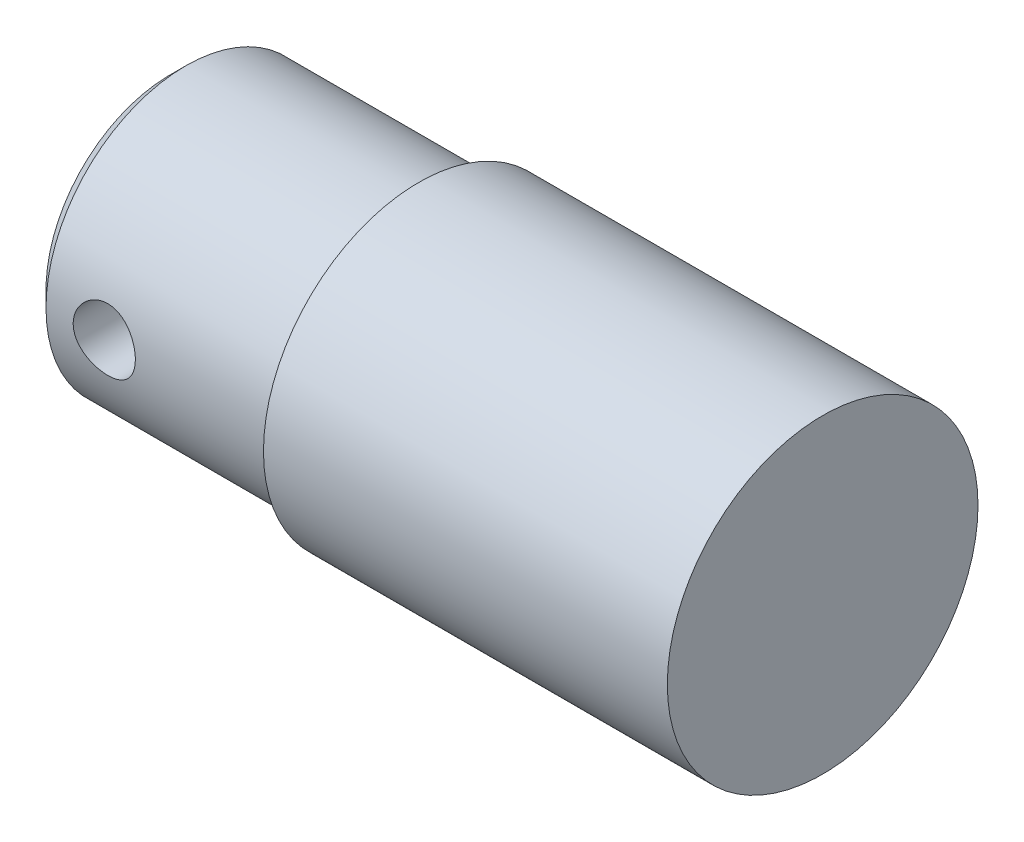
ISO-10303-21;
HEADER;
FILE_DESCRIPTION(('STEP AP214'),'2;1');
FILE_NAME('part.step','',(''),(''),'','','');
FILE_SCHEMA(('AUTOMOTIVE_DESIGN { 1 0 10303 214 1 1 1 1 }'));
ENDSEC;
DATA;
#1=APPLICATION_CONTEXT('core data for automotive mechanical design processes');
#2=APPLICATION_PROTOCOL_DEFINITION('international standard','automotive_design',2000,#1);
#3=PRODUCT_CONTEXT('',#1,'mechanical');
#4=PRODUCT('Part','Part','',(#3));
#5=PRODUCT_RELATED_PRODUCT_CATEGORY('part','',(#4));
#6=PRODUCT_DEFINITION_FORMATION('','',#4);
#7=PRODUCT_DEFINITION_CONTEXT('part definition',#1,'design');
#8=PRODUCT_DEFINITION('design','',#6,#7);
#9=PRODUCT_DEFINITION_SHAPE('','',#8);
#10=(LENGTH_UNIT() NAMED_UNIT(*) SI_UNIT(.MILLI.,.METRE.));
#11=(NAMED_UNIT(*) PLANE_ANGLE_UNIT() SI_UNIT($,.RADIAN.));
#12=(NAMED_UNIT(*) SI_UNIT($,.STERADIAN.) SOLID_ANGLE_UNIT());
#13=UNCERTAINTY_MEASURE_WITH_UNIT(LENGTH_MEASURE(1.E-05),#10,'distance_accuracy_value','');
#14=(GEOMETRIC_REPRESENTATION_CONTEXT(3) GLOBAL_UNCERTAINTY_ASSIGNED_CONTEXT((#13)) GLOBAL_UNIT_ASSIGNED_CONTEXT((#10,
#11,#12)) REPRESENTATION_CONTEXT('',''));
#15=CARTESIAN_POINT('',(0.,0.,0.));
#16=DIRECTION('',(0.,0.,1.));
#17=DIRECTION('',(1.,0.,0.));
#18=AXIS2_PLACEMENT_3D('',#15,#16,#17);
#19=CARTESIAN_POINT('',(0.,0.,0.));
#20=DIRECTION('',(1.,0.,0.));
#21=DIRECTION('',(0.,0.,-1.));
#22=AXIS2_PLACEMENT_3D('',#19,#20,#21);
#23=PLANE('',#22);
#24=CARTESIAN_POINT('',(0.,0.,0.));
#25=DIRECTION('',(1.,0.,0.));
#26=DIRECTION('',(0.,0.,-1.));
#27=AXIS2_PLACEMENT_3D('',#24,#25,#26);
#28=CIRCLE('',#27,20.);
#29=CARTESIAN_POINT('',(0.,0.,20.));
#30=VERTEX_POINT('',#29);
#31=EDGE_CURVE('E55',#30,#30,#28,.T.);
#32=ORIENTED_EDGE('',*,*,#31,.F.);
#33=EDGE_LOOP('',(#32));
#34=FACE_BOUND('',#33,.T.);
#35=CARTESIAN_POINT('',(0.,0.,0.));
#36=DIRECTION('',(1.,0.,0.));
#37=DIRECTION('',(0.,0.,-1.));
#38=AXIS2_PLACEMENT_3D('',#35,#36,#37);
#39=CIRCLE('',#38,18.);
#40=CARTESIAN_POINT('',(0.,0.,-18.));
#41=VERTEX_POINT('',#40);
#42=EDGE_CURVE('E46',#41,#41,#39,.F.);
#43=ORIENTED_EDGE('',*,*,#42,.F.);
#44=EDGE_LOOP('',(#43));
#45=FACE_BOUND('',#44,.T.);
#46=ADVANCED_FACE('F39',(#34,#45),#23,.F.);
#47=CARTESIAN_POINT('',(52.,0.,0.));
#48=DIRECTION('',(-1.,0.,0.));
#49=DIRECTION('',(0.,0.,1.));
#50=AXIS2_PLACEMENT_3D('',#47,#48,#49);
#51=CYLINDRICAL_SURFACE('',#50,20.);
#52=CARTESIAN_POINT('',(52.,0.,0.));
#53=DIRECTION('',(1.,0.,0.));
#54=DIRECTION('',(0.,0.,-1.));
#55=AXIS2_PLACEMENT_3D('',#52,#53,#54);
#56=CIRCLE('',#55,20.);
#57=CARTESIAN_POINT('',(52.,0.,20.));
#58=VERTEX_POINT('',#57);
#59=EDGE_CURVE('E50',#58,#58,#56,.T.);
#60=CARTESIAN_POINT('',(52.,0.,20.));
#61=CARTESIAN_POINT('',(51.4583333333333,0.,20.));
#62=CARTESIAN_POINT('',(50.9166666666667,0.,20.));
#63=CARTESIAN_POINT('',(49.8333333333333,0.,20.));
#64=CARTESIAN_POINT('',(49.2916666666667,0.,20.));
#65=CARTESIAN_POINT('',(48.2083333333333,0.,20.));
#66=CARTESIAN_POINT('',(47.6666666666667,0.,20.));
#67=CARTESIAN_POINT('',(46.5833333333333,0.,20.));
#68=CARTESIAN_POINT('',(46.0416666666667,0.,20.));
#69=CARTESIAN_POINT('',(44.9583333333333,0.,20.));
#70=CARTESIAN_POINT('',(44.4166666666667,0.,20.));
#71=CARTESIAN_POINT('',(43.3333333333333,0.,20.));
#72=CARTESIAN_POINT('',(42.7916666666667,0.,20.));
#73=CARTESIAN_POINT('',(41.7083333333333,0.,20.));
#74=CARTESIAN_POINT('',(41.1666666666667,0.,20.));
#75=CARTESIAN_POINT('',(40.0833333333333,0.,20.));
#76=CARTESIAN_POINT('',(39.5416666666667,0.,20.));
#77=CARTESIAN_POINT('',(38.4583333333333,0.,20.));
#78=CARTESIAN_POINT('',(37.9166666666667,0.,20.));
#79=CARTESIAN_POINT('',(36.8333333333333,0.,20.));
#80=CARTESIAN_POINT('',(36.2916666666667,0.,20.));
#81=CARTESIAN_POINT('',(35.2083333333333,0.,20.));
#82=CARTESIAN_POINT('',(34.6666666666667,0.,20.));
#83=CARTESIAN_POINT('',(33.5833333333333,0.,20.));
#84=CARTESIAN_POINT('',(33.0416666666667,0.,20.));
#85=CARTESIAN_POINT('',(31.9583333333333,0.,20.));
#86=CARTESIAN_POINT('',(31.4166666666667,0.,20.));
#87=CARTESIAN_POINT('',(30.3333333333333,0.,20.));
#88=CARTESIAN_POINT('',(29.7916666666667,0.,20.));
#89=CARTESIAN_POINT('',(28.7083333333333,0.,20.));
#90=CARTESIAN_POINT('',(28.1666666666667,0.,20.));
#91=CARTESIAN_POINT('',(27.0833333333333,0.,20.));
#92=CARTESIAN_POINT('',(26.5416666666667,0.,20.));
#93=CARTESIAN_POINT('',(25.4583333333333,0.,20.));
#94=CARTESIAN_POINT('',(24.9166666666667,0.,20.));
#95=CARTESIAN_POINT('',(23.8333333333333,0.,20.));
#96=CARTESIAN_POINT('',(23.2916666666667,0.,20.));
#97=CARTESIAN_POINT('',(22.2083333333333,0.,20.));
#98=CARTESIAN_POINT('',(21.6666666666667,0.,20.));
#99=CARTESIAN_POINT('',(20.5833333333333,0.,20.));
#100=CARTESIAN_POINT('',(20.0416666666667,0.,20.));
#101=CARTESIAN_POINT('',(18.9583333333333,0.,20.));
#102=CARTESIAN_POINT('',(18.4166666666667,0.,20.));
#103=CARTESIAN_POINT('',(17.3333333333333,0.,20.));
#104=CARTESIAN_POINT('',(16.7916666666667,0.,20.));
#105=CARTESIAN_POINT('',(15.7083333333333,0.,20.));
#106=CARTESIAN_POINT('',(15.1666666666667,0.,20.));
#107=CARTESIAN_POINT('',(14.0833333333333,0.,20.));
#108=CARTESIAN_POINT('',(13.5416666666667,0.,20.));
#109=CARTESIAN_POINT('',(12.4583333333333,0.,20.));
#110=CARTESIAN_POINT('',(11.9166666666667,0.,20.));
#111=CARTESIAN_POINT('',(10.8333333333333,0.,20.));
#112=CARTESIAN_POINT('',(10.2916666666667,0.,20.));
#113=CARTESIAN_POINT('',(9.20833333333333,0.,20.));
#114=CARTESIAN_POINT('',(8.66666666666667,0.,20.));
#115=CARTESIAN_POINT('',(7.58333333333333,0.,20.));
#116=CARTESIAN_POINT('',(7.04166666666667,0.,20.));
#117=CARTESIAN_POINT('',(5.95833333333333,0.,20.));
#118=CARTESIAN_POINT('',(5.41666666666667,0.,20.));
#119=CARTESIAN_POINT('',(4.33333333333333,0.,20.));
#120=CARTESIAN_POINT('',(3.79166666666667,0.,20.));
#121=CARTESIAN_POINT('',(2.70833333333334,0.,20.));
#122=CARTESIAN_POINT('',(2.16666666666667,0.,20.));
#123=CARTESIAN_POINT('',(1.08333333333333,0.,20.));
#124=CARTESIAN_POINT('',(0.541666666666667,0.,20.));
#125=CARTESIAN_POINT('',(0.,0.,20.));
#126=B_SPLINE_CURVE_WITH_KNOTS('',3,(#60,#61,#62,#63,#64,#65,#66,#67,#68,#69,#70,#71,#72,#73,
#74,#75,#76,#77,#78,#79,#80,#81,#82,#83,#84,#85,#86,#87,#88,#89,#90,#91,#92,#93,#94,#95,#96,#97,
#98,#99,#100,#101,#102,#103,#104,#105,#106,#107,#108,#109,#110,#111,#112,#113,#114,#115,#116,
#117,#118,#119,#120,#121,#122,#123,#124,#125),.UNSPECIFIED.,.F.,.F.,(4,2,2,2,2,2,2,2,2,2,2,2,2,
2,2,2,2,2,2,2,2,2,2,2,2,2,2,2,2,2,2,2,4),(0.,1.62499999999999,3.25,4.875,6.49999999999999,
8.12499999999999,9.74999999999999,11.375,13.,14.625,16.25,17.875,19.5,21.125,22.75,24.375,26.,
27.625,29.25,30.875,32.5,34.125,35.75,37.375,39.,40.625,42.25,43.875,45.5,47.125,48.75,50.375,
52.),.UNSPECIFIED.);
#127=EDGE_CURVE('BSEAM89',#58,#30,#126,.T.);
#128=ORIENTED_EDGE('',*,*,#59,.F.);
#129=ORIENTED_EDGE('',*,*,#31,.T.);
#130=ORIENTED_EDGE('',*,*,#127,.T.);
#131=ORIENTED_EDGE('',*,*,#127,.F.);
#132=EDGE_LOOP('',(#128,#130,#129,#131));
#133=FACE_BOUND('',#132,.T.);
#134=ADVANCED_FACE('F89',(#133),#51,.T.);
#135=CARTESIAN_POINT('',(52.,0.,0.));
#136=DIRECTION('',(1.,0.,0.));
#137=DIRECTION('',(0.,0.,-1.));
#138=AXIS2_PLACEMENT_3D('',#135,#136,#137);
#139=PLANE('',#138);
#140=ORIENTED_EDGE('',*,*,#59,.T.);
#141=EDGE_LOOP('',(#140));
#142=FACE_BOUND('',#141,.T.);
#143=ADVANCED_FACE('F96',(#142),#139,.T.);
#144=CARTESIAN_POINT('',(-32.,0.,0.));
#145=DIRECTION('',(1.,0.,0.));
#146=DIRECTION('',(0.,0.,-1.));
#147=AXIS2_PLACEMENT_3D('',#144,#145,#146);
#148=CYLINDRICAL_SURFACE('',#147,18.);
#149=CARTESIAN_POINT('',(-30.,0.,0.));
#150=DIRECTION('',(-1.,0.,0.));
#151=DIRECTION('',(0.,0.,1.));
#152=AXIS2_PLACEMENT_3D('',#149,#150,#151);
#153=CIRCLE('',#152,18.);
#154=CARTESIAN_POINT('',(-30.,0.,18.));
#155=VERTEX_POINT('',#154);
#156=EDGE_CURVE('E10',#155,#155,#153,.F.);
#157=ORIENTED_EDGE('',*,*,#156,.T.);
#158=EDGE_LOOP('',(#157));
#159=FACE_BOUND('',#158,.T.);
#160=CARTESIAN_POINT('',(-26.5,0.,-18.));
#161=CARTESIAN_POINT('',(-26.4999925526404,-0.221760953551296,-17.999995924365));
#162=CARTESIAN_POINT('',(-26.481496036673,-0.44361113053924,-17.9958602799138));
#163=CARTESIAN_POINT('',(-26.4080790552989,-0.881003888206268,-17.9797619551534));
#164=CARTESIAN_POINT('',(-26.3531331319814,-1.09654195027798,-17.9677938043471));
#165=CARTESIAN_POINT('',(-26.2086280590167,-1.51492655552305,-17.93736226338));
#166=CARTESIAN_POINT('',(-26.1191056460043,-1.71778630420057,-17.9189057687811));
#167=CARTESIAN_POINT('',(-25.9081067750552,-2.10560036062752,-17.8774867088281));
#168=CARTESIAN_POINT('',(-25.7866309374187,-2.2905550158667,-17.8545242309492));
#169=CARTESIAN_POINT('',(-25.5130486697867,-2.64037262802806,-17.8061818834822));
#170=CARTESIAN_POINT('',(-25.3605149957299,-2.80489722408704,-17.7807712328209));
#171=CARTESIAN_POINT('',(-25.0300638798135,-3.10624982091676,-17.7306120216034));
#172=CARTESIAN_POINT('',(-24.8521441185784,-3.24307528821719,-17.7058635217896));
#173=CARTESIAN_POINT('',(-24.4734563118841,-3.48664886820692,-17.6595265652052));
#174=CARTESIAN_POINT('',(-24.2724500839197,-3.59303484208773,-17.6379775147509));
#175=CARTESIAN_POINT('',(-23.8548544766124,-3.7703859790905,-17.6009219271566));
#176=CARTESIAN_POINT('',(-23.6382670289814,-3.84135552440318,-17.5854146425013));
#177=CARTESIAN_POINT('',(-23.1993330453557,-3.94473716012895,-17.5625121887839));
#178=CARTESIAN_POINT('',(-22.9771345698079,-3.9777493407595,-17.5549909146757));
#179=CARTESIAN_POINT('',(-22.5302355644511,-4.00614541995133,-17.5485334731373));
#180=CARTESIAN_POINT('',(-22.3055353560863,-4.00153409823357,-17.5495962151866));
#181=CARTESIAN_POINT('',(-21.8644867456112,-3.95529655034669,-17.5600726433475));
#182=CARTESIAN_POINT('',(-21.648060751721,-3.91436928920452,-17.5693286277999));
#183=CARTESIAN_POINT('',(-21.2252257133503,-3.79776981362275,-17.5948990837304));
#184=CARTESIAN_POINT('',(-21.0188172478293,-3.72209559363299,-17.6112139626358));
#185=CARTESIAN_POINT('',(-20.6199211232361,-3.53751345745754,-17.6492181994339));
#186=CARTESIAN_POINT('',(-20.4275613453278,-3.42833838758707,-17.6709504872573));
#187=CARTESIAN_POINT('',(-20.0636342589682,-3.18004136279698,-17.7173147582074));
#188=CARTESIAN_POINT('',(-19.8920698763597,-3.04091520148548,-17.7419471484099));
#189=CARTESIAN_POINT('',(-19.5705813813031,-2.73297367405966,-17.7920114922554));
#190=CARTESIAN_POINT('',(-19.4212264297899,-2.56356441053247,-17.817449013758));
#191=CARTESIAN_POINT('',(-19.1529525421858,-2.20181323618324,-17.8657567824458));
#192=CARTESIAN_POINT('',(-19.0340341924362,-2.00947088367474,-17.8886269801684));
#193=CARTESIAN_POINT('',(-18.8298614484464,-1.60660638146947,-17.9293012846723));
#194=CARTESIAN_POINT('',(-18.7446835113835,-1.39604424463971,-17.9470938601532));
#195=CARTESIAN_POINT('',(-18.6110779738843,-0.963111861962915,-17.9755227273251));
#196=CARTESIAN_POINT('',(-18.5626448531717,-0.740743395186733,-17.9861600939357));
#197=CARTESIAN_POINT('',(-18.5047359734897,-0.295390966561692,-17.9989263552335));
#198=CARTESIAN_POINT('',(-18.4944829996766,-0.0725127946378132,-18.0012249724458));
#199=CARTESIAN_POINT('',(-18.5111162085207,0.371771847856157,-17.997531173012));
#200=CARTESIAN_POINT('',(-18.5379997866389,0.59317842054129,-17.9915393378093));
#201=CARTESIAN_POINT('',(-18.6274988303362,1.02564651465884,-17.9720451751721));
#202=CARTESIAN_POINT('',(-18.6897049124469,1.23679698343096,-17.9586289401548));
#203=CARTESIAN_POINT('',(-18.8476273748902,1.64566561171167,-17.9257884217364));
#204=CARTESIAN_POINT('',(-18.9433466726121,1.84338260002038,-17.9063636152949));
#205=CARTESIAN_POINT('',(-19.1671857535979,2.22297287978873,-17.863243064551));
#206=CARTESIAN_POINT('',(-19.295759886012,2.40457146166439,-17.8394888917983));
#207=CARTESIAN_POINT('',(-19.5810624982032,2.74389392997634,-17.7904606469882));
#208=CARTESIAN_POINT('',(-19.7377947606655,2.90161460346862,-17.7651863710281));
#209=CARTESIAN_POINT('',(-20.0785360671601,3.19179096381932,-17.7153775788911));
#210=CARTESIAN_POINT('',(-20.2630081800084,3.32370763880002,-17.6908663531912));
#211=CARTESIAN_POINT('',(-20.6519440688264,3.55469223845647,-17.6459079076606));
#212=CARTESIAN_POINT('',(-20.8564069707022,3.65376159854484,-17.6254605102581));
#213=CARTESIAN_POINT('',(-21.2784165781991,3.81556003792242,-17.5911440106273));
#214=CARTESIAN_POINT('',(-21.4958808844849,3.87849572707933,-17.5772375918896));
#215=CARTESIAN_POINT('',(-21.9386483696685,3.96684055315164,-17.5575129926446));
#216=CARTESIAN_POINT('',(-22.1639502420333,3.992255914363,-17.5516934706011));
#217=CARTESIAN_POINT('',(-22.6105577565673,4.00456713282469,-17.5488880293173));
#218=CARTESIAN_POINT('',(-22.831839016123,3.99231826287969,-17.551705967493));
#219=CARTESIAN_POINT('',(-23.2690994199308,3.93156554243273,-17.5654132990604));
#220=CARTESIAN_POINT('',(-23.4850786308462,3.88306214800451,-17.5763025909164));
#221=CARTESIAN_POINT('',(-23.9048982404555,3.75159639961516,-17.6048285626546));
#222=CARTESIAN_POINT('',(-24.1087806337634,3.66876233256914,-17.6224401036619));
#223=CARTESIAN_POINT('',(-24.4998799850932,3.47109540696676,-17.6624352893747));
#224=CARTESIAN_POINT('',(-24.687095139928,3.35625909170385,-17.6848194495309));
#225=CARTESIAN_POINT('',(-25.043753217896,3.09502717981118,-17.7324208567084));
#226=CARTESIAN_POINT('',(-25.2127444098453,2.94802371022077,-17.7576874273553));
#227=CARTESIAN_POINT('',(-25.5239401478626,2.62785741189007,-17.8078794834673));
#228=CARTESIAN_POINT('',(-25.6661384810168,2.45468853246686,-17.8328048885809));
#229=CARTESIAN_POINT('',(-25.9215519658398,2.08429194129113,-17.8799051945318));
#230=CARTESIAN_POINT('',(-26.0343503994699,1.88677127326989,-17.9020384699846));
#231=CARTESIAN_POINT('',(-26.2249666083624,1.47512055955763,-17.9406411673849));
#232=CARTESIAN_POINT('',(-26.3028132800923,1.26100440662599,-17.9571152654163));
#233=CARTESIAN_POINT('',(-26.4076827005536,0.872276495458815,-17.9796562581911));
#234=CARTESIAN_POINT('',(-26.4422347473326,0.69974398380336,-17.9872373804642));
#235=CARTESIAN_POINT('',(-26.4883958086123,0.351492899789053,-17.9974107491958));
#236=CARTESIAN_POINT('',(-26.5000059030038,0.175774477785755,-18.0000032304723));
#237=CARTESIAN_POINT('',(-26.5,0.,-18.));
#238=B_SPLINE_CURVE_WITH_KNOTS('',3,(#160,#161,#162,#163,#164,#165,#166,#167,#168,#169,#170,
#171,#172,#173,#174,#175,#176,#177,#178,#179,#180,#181,#182,#183,#184,#185,#186,#187,#188,#189,
#190,#191,#192,#193,#194,#195,#196,#197,#198,#199,#200,#201,#202,#203,#204,#205,#206,#207,#208,
#209,#210,#211,#212,#213,#214,#215,#216,#217,#218,#219,#220,#221,#222,#223,#224,#225,#226,#227,
#228,#229,#230,#231,#232,#233,#234,#235,#236,#237),.UNSPECIFIED.,.T.,.F.,(4,2,2,2,2,2,2,2,2,2,2,
2,2,2,2,2,2,2,2,2,2,2,2,2,2,2,2,2,2,2,2,2,2,2,2,2,2,2,4),(0.,0.664639379459593,1.32974346249857,
1.99414282481492,2.65852929033978,3.33276144004158,4.00705522981028,4.68906592595952,
5.3709922137548,6.04198251278955,6.71288756998729,7.37115336297115,8.02945715499427,
8.69315339424711,9.35694290522148,10.035563596235,10.714197359452,11.3943602562802,
12.0744209500952,12.7405598425409,13.4066520183008,14.0651773885588,14.7237600989647,
15.3919960652963,16.0603218678106,16.74138946217,17.4224272902637,18.099531181182,
18.7765227338287,19.4382557029488,20.0999803477577,20.7592542404161,21.4185993718282,
22.091686526357,22.7649295694287,23.4472517410919,24.1290087575192,24.6558469472716,
25.1826603378595),.UNSPECIFIED.);
#239=CARTESIAN_POINT('',(-26.5,0.,-18.));
#240=VERTEX_POINT('',#239);
#241=EDGE_CURVE('E66',#240,#240,#238,.T.);
#242=ORIENTED_EDGE('',*,*,#241,.T.);
#243=EDGE_LOOP('',(#242));
#244=FACE_BOUND('',#243,.T.);
#245=CARTESIAN_POINT('',(-18.5,0.,18.));
#246=CARTESIAN_POINT('',(-18.5000074473596,-0.221760953551299,17.999995924365));
#247=CARTESIAN_POINT('',(-18.518503963327,-0.443611130539243,17.9958602799138));
#248=CARTESIAN_POINT('',(-18.5919209447011,-0.88100388820627,17.9797619551534));
#249=CARTESIAN_POINT('',(-18.6468668680186,-1.09654195027798,17.9677938043471));
#250=CARTESIAN_POINT('',(-18.7913719409833,-1.51492655552306,17.93736226338));
#251=CARTESIAN_POINT('',(-18.8808943539957,-1.71778630420057,17.9189057687811));
#252=CARTESIAN_POINT('',(-19.0918932249448,-2.10560036062753,17.8774867088281));
#253=CARTESIAN_POINT('',(-19.2133690625813,-2.2905550158667,17.8545242309492));
#254=CARTESIAN_POINT('',(-19.4869513302133,-2.64037262802806,17.8061818834822));
#255=CARTESIAN_POINT('',(-19.6394850042701,-2.80489722408705,17.7807712328209));
#256=CARTESIAN_POINT('',(-19.9699361201865,-3.10624982091677,17.7306120216034));
#257=CARTESIAN_POINT('',(-20.1478558814216,-3.2430752882172,17.7058635217896));
#258=CARTESIAN_POINT('',(-20.5265436881159,-3.48664886820692,17.6595265652052));
#259=CARTESIAN_POINT('',(-20.7275499160803,-3.59303484208774,17.6379775147509));
#260=CARTESIAN_POINT('',(-21.1451455233876,-3.7703859790905,17.6009219271566));
#261=CARTESIAN_POINT('',(-21.3617329710186,-3.84135552440318,17.5854146425013));
#262=CARTESIAN_POINT('',(-21.8006669546443,-3.94473716012895,17.5625121887839));
#263=CARTESIAN_POINT('',(-22.0228654301921,-3.9777493407595,17.5549909146757));
#264=CARTESIAN_POINT('',(-22.4697644355489,-4.00614541995133,17.5485334731373));
#265=CARTESIAN_POINT('',(-22.6944646439137,-4.00153409823357,17.5495962151866));
#266=CARTESIAN_POINT('',(-23.1355132543888,-3.95529655034669,17.5600726433475));
#267=CARTESIAN_POINT('',(-23.351939248279,-3.91436928920452,17.5693286277999));
#268=CARTESIAN_POINT('',(-23.7747742866497,-3.79776981362275,17.5948990837304));
#269=CARTESIAN_POINT('',(-23.9811827521707,-3.72209559363298,17.6112139626358));
#270=CARTESIAN_POINT('',(-24.3800788767639,-3.53751345745754,17.6492181994339));
#271=CARTESIAN_POINT('',(-24.5724386546722,-3.42833838758707,17.6709504872573));
#272=CARTESIAN_POINT('',(-24.9363657410318,-3.18004136279698,17.7173147582074));
#273=CARTESIAN_POINT('',(-25.1079301236403,-3.04091520148548,17.7419471484099));
#274=CARTESIAN_POINT('',(-25.4294186186969,-2.73297367405966,17.7920114922554));
#275=CARTESIAN_POINT('',(-25.5787735702101,-2.56356441053247,17.817449013758));
#276=CARTESIAN_POINT('',(-25.8470474578142,-2.20181323618324,17.8657567824458));
#277=CARTESIAN_POINT('',(-25.9659658075638,-2.00947088367474,17.8886269801684));
#278=CARTESIAN_POINT('',(-26.1701385515536,-1.60660638146947,17.9293012846723));
#279=CARTESIAN_POINT('',(-26.2553164886165,-1.39604424463971,17.9470938601532));
#280=CARTESIAN_POINT('',(-26.3889220261157,-0.963111861962915,17.9755227273251));
#281=CARTESIAN_POINT('',(-26.4373551468282,-0.740743395186733,17.9861600939357));
#282=CARTESIAN_POINT('',(-26.4952640265103,-0.295390966561692,17.9989263552335));
#283=CARTESIAN_POINT('',(-26.5055170003234,-0.0725127946378125,18.0012249724458));
#284=CARTESIAN_POINT('',(-26.4888837914793,0.371771847856158,17.997531173012));
#285=CARTESIAN_POINT('',(-26.4620002133611,0.593178420541291,17.9915393378093));
#286=CARTESIAN_POINT('',(-26.3725011696638,1.02564651465884,17.9720451751721));
#287=CARTESIAN_POINT('',(-26.3102950875531,1.23679698343096,17.9586289401548));
#288=CARTESIAN_POINT('',(-26.1523726251098,1.64566561171167,17.9257884217364));
#289=CARTESIAN_POINT('',(-26.0566533273879,1.84338260002038,17.9063636152949));
#290=CARTESIAN_POINT('',(-25.8328142464021,2.22297287978873,17.863243064551));
#291=CARTESIAN_POINT('',(-25.704240113988,2.40457146166439,17.8394888917983));
#292=CARTESIAN_POINT('',(-25.4189375017968,2.74389392997634,17.7904606469882));
#293=CARTESIAN_POINT('',(-25.2622052393345,2.90161460346863,17.7651863710281));
#294=CARTESIAN_POINT('',(-24.9214639328399,3.19179096381932,17.7153775788911));
#295=CARTESIAN_POINT('',(-24.7369918199916,3.32370763880002,17.6908663531912));
#296=CARTESIAN_POINT('',(-24.3480559311736,3.55469223845648,17.6459079076606));
#297=CARTESIAN_POINT('',(-24.1435930292978,3.65376159854484,17.6254605102581));
#298=CARTESIAN_POINT('',(-23.7215834218009,3.81556003792242,17.5911440106273));
#299=CARTESIAN_POINT('',(-23.5041191155151,3.87849572707933,17.5772375918896));
#300=CARTESIAN_POINT('',(-23.0613516303315,3.96684055315164,17.5575129926446));
#301=CARTESIAN_POINT('',(-22.8360497579667,3.992255914363,17.5516934706011));
#302=CARTESIAN_POINT('',(-22.3894422434327,4.00456713282469,17.5488880293173));
#303=CARTESIAN_POINT('',(-22.168160983877,3.99231826287969,17.551705967493));
#304=CARTESIAN_POINT('',(-21.7309005800692,3.93156554243273,17.5654132990604));
#305=CARTESIAN_POINT('',(-21.5149213691538,3.88306214800451,17.5763025909165));
#306=CARTESIAN_POINT('',(-21.0951017595445,3.75159639961516,17.6048285626546));
#307=CARTESIAN_POINT('',(-20.8912193662366,3.66876233256914,17.6224401036619));
#308=CARTESIAN_POINT('',(-20.5001200149067,3.47109540696676,17.6624352893747));
#309=CARTESIAN_POINT('',(-20.312904860072,3.35625909170385,17.6848194495309));
#310=CARTESIAN_POINT('',(-19.956246782104,3.09502717981117,17.7324208567084));
#311=CARTESIAN_POINT('',(-19.7872555901547,2.94802371022077,17.7576874273553));
#312=CARTESIAN_POINT('',(-19.4760598521374,2.62785741189007,17.8078794834673));
#313=CARTESIAN_POINT('',(-19.3338615189832,2.45468853246686,17.8328048885809));
#314=CARTESIAN_POINT('',(-19.0784480341602,2.08429194129113,17.8799051945318));
#315=CARTESIAN_POINT('',(-18.9656496005301,1.8867712732699,17.9020384699846));
#316=CARTESIAN_POINT('',(-18.7750333916376,1.47512055955763,17.9406411673849));
#317=CARTESIAN_POINT('',(-18.6971867199077,1.26100440662599,17.9571152654163));
#318=CARTESIAN_POINT('',(-18.5923172994464,0.872276495458813,17.9796562581911));
#319=CARTESIAN_POINT('',(-18.5577652526674,0.69974398380336,17.9872373804642));
#320=CARTESIAN_POINT('',(-18.5116041913877,0.351492899789053,17.9974107491958));
#321=CARTESIAN_POINT('',(-18.4999940969962,0.175774477785753,18.0000032304723));
#322=CARTESIAN_POINT('',(-18.5,0.,18.));
#323=B_SPLINE_CURVE_WITH_KNOTS('',3,(#245,#246,#247,#248,#249,#250,#251,#252,#253,#254,#255,
#256,#257,#258,#259,#260,#261,#262,#263,#264,#265,#266,#267,#268,#269,#270,#271,#272,#273,#274,
#275,#276,#277,#278,#279,#280,#281,#282,#283,#284,#285,#286,#287,#288,#289,#290,#291,#292,#293,
#294,#295,#296,#297,#298,#299,#300,#301,#302,#303,#304,#305,#306,#307,#308,#309,#310,#311,#312,
#313,#314,#315,#316,#317,#318,#319,#320,#321,#322),.UNSPECIFIED.,.T.,.F.,(4,2,2,2,2,2,2,2,2,2,2,
2,2,2,2,2,2,2,2,2,2,2,2,2,2,2,2,2,2,2,2,2,2,2,2,2,2,2,4),(0.,0.664639379459593,1.32974346249857,
1.99414282481492,2.65852929033978,3.33276144004158,4.00705522981028,4.68906592595951,
5.3709922137548,6.04198251278955,6.71288756998729,7.37115336297115,8.02945715499427,
8.69315339424711,9.35694290522148,10.035563596235,10.714197359452,11.3943602562802,
12.0744209500952,12.7405598425409,13.4066520183008,14.0651773885588,14.7237600989647,
15.3919960652963,16.0603218678106,16.74138946217,17.4224272902637,18.099531181182,
18.7765227338287,19.4382557029488,20.0999803477577,20.7592542404161,21.4185993718282,
22.091686526357,22.7649295694287,23.4472517410919,24.1290087575192,24.6558469472716,
25.1826603378595),.UNSPECIFIED.);
#324=CARTESIAN_POINT('',(-18.5,0.,18.));
#325=VERTEX_POINT('',#324);
#326=EDGE_CURVE('E59',#325,#325,#323,.T.);
#327=ORIENTED_EDGE('',*,*,#326,.T.);
#328=EDGE_LOOP('',(#327));
#329=FACE_BOUND('',#328,.T.);
#330=ORIENTED_EDGE('',*,*,#42,.T.);
#331=EDGE_LOOP('',(#330));
#332=FACE_BOUND('',#331,.T.);
#333=ADVANCED_FACE('F71',(#159,#244,#329,#332),#148,.T.);
#334=CARTESIAN_POINT('',(-22.5,0.,-20.));
#335=DIRECTION('',(0.,0.,1.));
#336=DIRECTION('',(1.,0.,0.));
#337=AXIS2_PLACEMENT_3D('',#334,#335,#336);
#338=CYLINDRICAL_SURFACE('',#337,4.);
#339=ORIENTED_EDGE('',*,*,#326,.F.);
#340=EDGE_LOOP('',(#339));
#341=FACE_BOUND('',#340,.T.);
#342=ORIENTED_EDGE('',*,*,#241,.F.);
#343=EDGE_LOOP('',(#342));
#344=FACE_BOUND('',#343,.T.);
#345=ADVANCED_FACE('F74',(#341,#344),#338,.F.);
#346=CARTESIAN_POINT('',(-32.,0.,0.));
#347=DIRECTION('',(1.,0.,0.));
#348=DIRECTION('',(0.,0.,-1.));
#349=AXIS2_PLACEMENT_3D('',#346,#347,#348);
#350=CONICAL_SURFACE('',#349,16.,0.785398163397447);
#351=ORIENTED_EDGE('',*,*,#156,.F.);
#352=EDGE_LOOP('',(#351));
#353=FACE_BOUND('',#352,.T.);
#354=CARTESIAN_POINT('',(-32.,0.,0.));
#355=DIRECTION('',(1.,0.,0.));
#356=DIRECTION('',(0.,0.,-1.));
#357=AXIS2_PLACEMENT_3D('',#354,#355,#356);
#358=CIRCLE('',#357,16.);
#359=CARTESIAN_POINT('',(-32.,0.,-16.));
#360=VERTEX_POINT('',#359);
#361=EDGE_CURVE('E67',#360,#360,#358,.F.);
#362=ORIENTED_EDGE('',*,*,#361,.F.);
#363=EDGE_LOOP('',(#362));
#364=FACE_BOUND('',#363,.T.);
#365=ADVANCED_FACE('F41',(#353,#364),#350,.T.);
#366=CARTESIAN_POINT('',(-32.,0.,0.));
#367=DIRECTION('',(1.,0.,0.));
#368=DIRECTION('',(0.,0.,-1.));
#369=AXIS2_PLACEMENT_3D('',#366,#367,#368);
#370=PLANE('',#369);
#371=ORIENTED_EDGE('',*,*,#361,.T.);
#372=EDGE_LOOP('',(#371));
#373=FACE_BOUND('',#372,.T.);
#374=ADVANCED_FACE('F79',(#373),#370,.F.);
#375=CLOSED_SHELL('',(#46,#134,#143,#333,#345,#365,#374));
#376=MANIFOLD_SOLID_BREP('B2',#375);
#377=ADVANCED_BREP_SHAPE_REPRESENTATION('',(#18,#376),#14);
#378=SHAPE_DEFINITION_REPRESENTATION(#9,#377);
ENDSEC;
END-ISO-10303-21;
